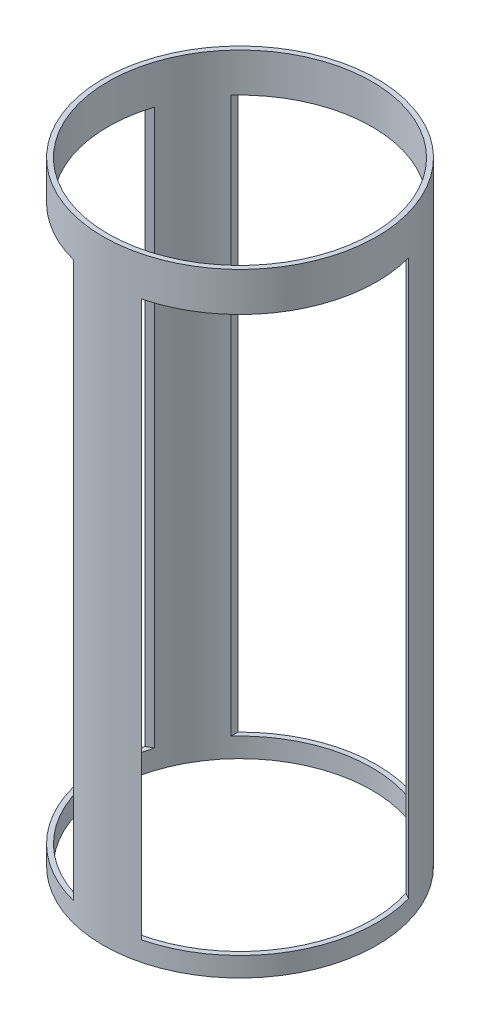
ISO-10303-21;
HEADER;
FILE_DESCRIPTION(('STEP AP214'),'2;1');
FILE_NAME('part.step','',(''),(''),'','','');
FILE_SCHEMA(('AUTOMOTIVE_DESIGN { 1 0 10303 214 1 1 1 1 }'));
ENDSEC;
DATA;
#1=APPLICATION_CONTEXT('core data for automotive mechanical design processes');
#2=APPLICATION_PROTOCOL_DEFINITION('international standard','automotive_design',2000,#1);
#3=PRODUCT_CONTEXT('',#1,'mechanical');
#4=PRODUCT('Part','Part','',(#3));
#5=PRODUCT_RELATED_PRODUCT_CATEGORY('part','',(#4));
#6=PRODUCT_DEFINITION_FORMATION('','',#4);
#7=PRODUCT_DEFINITION_CONTEXT('part definition',#1,'design');
#8=PRODUCT_DEFINITION('design','',#6,#7);
#9=PRODUCT_DEFINITION_SHAPE('','',#8);
#10=(LENGTH_UNIT() NAMED_UNIT(*) SI_UNIT(.MILLI.,.METRE.));
#11=(NAMED_UNIT(*) PLANE_ANGLE_UNIT() SI_UNIT($,.RADIAN.));
#12=(NAMED_UNIT(*) SI_UNIT($,.STERADIAN.) SOLID_ANGLE_UNIT());
#13=UNCERTAINTY_MEASURE_WITH_UNIT(LENGTH_MEASURE(1.E-05),#10,'distance_accuracy_value','');
#14=(GEOMETRIC_REPRESENTATION_CONTEXT(3) GLOBAL_UNCERTAINTY_ASSIGNED_CONTEXT((#13)) GLOBAL_UNIT_ASSIGNED_CONTEXT((#10,
#11,#12)) REPRESENTATION_CONTEXT('',''));
#15=CARTESIAN_POINT('',(0.,0.,0.));
#16=DIRECTION('',(0.,0.,1.));
#17=DIRECTION('',(1.,0.,0.));
#18=AXIS2_PLACEMENT_3D('',#15,#16,#17);
#19=CARTESIAN_POINT('',(0.,199.39,0.));
#20=DIRECTION('',(0.,1.,0.));
#21=DIRECTION('',(0.,0.,1.));
#22=AXIS2_PLACEMENT_3D('',#19,#20,#21);
#23=PLANE('',#22);
#24=CARTESIAN_POINT('',(0.,199.39,0.));
#25=DIRECTION('',(0.,1.,0.));
#26=DIRECTION('',(0.,0.,1.));
#27=AXIS2_PLACEMENT_3D('',#24,#25,#26);
#28=CIRCLE('',#27,88.9);
#29=CARTESIAN_POINT('',(0.,199.39,88.9));
#30=VERTEX_POINT('',#29);
#31=EDGE_CURVE('E226',#30,#30,#28,.T.);
#32=ORIENTED_EDGE('',*,*,#31,.T.);
#33=EDGE_LOOP('',(#32));
#34=FACE_BOUND('',#33,.T.);
#35=CARTESIAN_POINT('',(0.,199.39,0.));
#36=DIRECTION('',(0.,1.,0.));
#37=DIRECTION('',(0.,0.,1.));
#38=AXIS2_PLACEMENT_3D('',#35,#36,#37);
#39=CIRCLE('',#38,85.725);
#40=CARTESIAN_POINT('',(0.,199.39,85.725));
#41=VERTEX_POINT('',#40);
#42=EDGE_CURVE('E220',#41,#41,#39,.T.);
#43=ORIENTED_EDGE('',*,*,#42,.F.);
#44=EDGE_LOOP('',(#43));
#45=FACE_BOUND('',#44,.T.);
#46=ADVANCED_FACE('F41',(#34,#45),#23,.T.);
#47=CARTESIAN_POINT('',(0.,-199.39,0.));
#48=DIRECTION('',(0.,1.,0.));
#49=DIRECTION('',(0.,0.,1.));
#50=AXIS2_PLACEMENT_3D('',#47,#48,#49);
#51=PLANE('',#50);
#52=CARTESIAN_POINT('',(0.,-199.39,0.));
#53=DIRECTION('',(0.,1.,0.));
#54=DIRECTION('',(0.,0.,1.));
#55=AXIS2_PLACEMENT_3D('',#52,#53,#54);
#56=CIRCLE('',#55,88.9);
#57=CARTESIAN_POINT('',(0.,-199.39,88.9));
#58=VERTEX_POINT('',#57);
#59=EDGE_CURVE('E223',#58,#58,#56,.T.);
#60=ORIENTED_EDGE('',*,*,#59,.F.);
#61=EDGE_LOOP('',(#60));
#62=FACE_BOUND('',#61,.T.);
#63=CARTESIAN_POINT('',(0.,-199.39,0.));
#64=DIRECTION('',(0.,1.,0.));
#65=DIRECTION('',(0.,0.,1.));
#66=AXIS2_PLACEMENT_3D('',#63,#64,#65);
#67=CIRCLE('',#66,85.725);
#68=CARTESIAN_POINT('',(0.,-199.39,85.725));
#69=VERTEX_POINT('',#68);
#70=EDGE_CURVE('E200',#69,#69,#67,.T.);
#71=ORIENTED_EDGE('',*,*,#70,.T.);
#72=EDGE_LOOP('',(#71));
#73=FACE_BOUND('',#72,.T.);
#74=ADVANCED_FACE('F256',(#62,#73),#51,.F.);
#75=CARTESIAN_POINT('',(0.,199.39,0.));
#76=DIRECTION('',(0.,-1.,0.));
#77=DIRECTION('',(0.,0.,-1.));
#78=AXIS2_PLACEMENT_3D('',#75,#76,#77);
#79=CYLINDRICAL_SURFACE('',#78,88.9);
#80=CARTESIAN_POINT('',(0.,-186.69,0.));
#81=DIRECTION('',(0.,-1.,0.));
#82=DIRECTION('',(0.866025403784436,0.,0.500000000000004));
#83=AXIS2_PLACEMENT_3D('',#80,#81,#82);
#84=CIRCLE('',#83,88.9);
#85=CARTESIAN_POINT('',(22.1315367264145,-186.69,86.1011328736583));
#86=VERTEX_POINT('',#85);
#87=CARTESIAN_POINT('',(85.631536726415,-186.69,-23.8840934069651));
#88=VERTEX_POINT('',#87);
#89=EDGE_CURVE('E162',#86,#88,#84,.F.);
#90=ORIENTED_EDGE('',*,*,#89,.F.);
#91=DIRECTION('',(0.,-1.,0.));
#92=VECTOR('',#91,1.);
#93=CARTESIAN_POINT('',(22.1315367264145,199.39,86.1011328736583));
#94=LINE('',#93,#92);
#95=CARTESIAN_POINT('',(22.1315367264145,173.99,86.1011328736583));
#96=VERTEX_POINT('',#95);
#97=EDGE_CURVE('E167',#96,#86,#94,.T.);
#98=ORIENTED_EDGE('',*,*,#97,.F.);
#99=CARTESIAN_POINT('',(0.,173.99,0.));
#100=DIRECTION('',(0.,1.,0.));
#101=DIRECTION('',(0.500000000000004,0.,-0.866025403784436));
#102=AXIS2_PLACEMENT_3D('',#99,#100,#101);
#103=CIRCLE('',#102,88.9);
#104=CARTESIAN_POINT('',(85.631536726415,173.99,-23.8840934069651));
#105=VERTEX_POINT('',#104);
#106=EDGE_CURVE('E141',#105,#96,#103,.F.);
#107=ORIENTED_EDGE('',*,*,#106,.F.);
#108=DIRECTION('',(0.,-1.,0.));
#109=VECTOR('',#108,1.);
#110=CARTESIAN_POINT('',(85.631536726415,199.39,-23.8840934069651));
#111=LINE('',#110,#109);
#112=EDGE_CURVE('E56',#88,#105,#111,.F.);
#113=ORIENTED_EDGE('',*,*,#112,.F.);
#114=EDGE_LOOP('',(#90,#98,#107,#113));
#115=FACE_BOUND('',#114,.T.);
#116=CARTESIAN_POINT('',(0.,-186.69,0.));
#117=DIRECTION('',(0.,-1.,0.));
#118=DIRECTION('',(-0.866025403784443,0.,0.499999999999992));
#119=AXIS2_PLACEMENT_3D('',#116,#117,#118);
#120=CIRCLE('',#119,88.9);
#121=CARTESIAN_POINT('',(-85.6315367264147,-186.69,-23.8840934069663));
#122=VERTEX_POINT('',#121);
#123=CARTESIAN_POINT('',(-22.1315367264158,-186.69,86.101132873658));
#124=VERTEX_POINT('',#123);
#125=EDGE_CURVE('E191',#122,#124,#120,.F.);
#126=ORIENTED_EDGE('',*,*,#125,.F.);
#127=DIRECTION('',(0.,-1.,0.));
#128=VECTOR('',#127,1.);
#129=CARTESIAN_POINT('',(-85.6315367264147,199.39,-23.8840934069663));
#130=LINE('',#129,#128);
#131=CARTESIAN_POINT('',(-85.6315367264147,173.99,-23.8840934069663));
#132=VERTEX_POINT('',#131);
#133=EDGE_CURVE('E142',#132,#122,#130,.T.);
#134=ORIENTED_EDGE('',*,*,#133,.F.);
#135=CARTESIAN_POINT('',(0.,173.99,0.));
#136=DIRECTION('',(0.,1.,0.));
#137=DIRECTION('',(0.499999999999992,0.,0.866025403784443));
#138=AXIS2_PLACEMENT_3D('',#135,#136,#137);
#139=CIRCLE('',#138,88.9);
#140=CARTESIAN_POINT('',(-22.1315367264158,173.99,86.101132873658));
#141=VERTEX_POINT('',#140);
#142=EDGE_CURVE('E173',#141,#132,#139,.F.);
#143=ORIENTED_EDGE('',*,*,#142,.F.);
#144=DIRECTION('',(0.,-1.,0.));
#145=VECTOR('',#144,1.);
#146=CARTESIAN_POINT('',(-22.1315367264158,199.39,86.101132873658));
#147=LINE('',#146,#145);
#148=EDGE_CURVE('E64',#124,#141,#147,.F.);
#149=ORIENTED_EDGE('',*,*,#148,.F.);
#150=EDGE_LOOP('',(#126,#134,#143,#149));
#151=FACE_BOUND('',#150,.T.);
#152=CARTESIAN_POINT('',(0.,-186.69,0.));
#153=DIRECTION('',(0.,-1.,0.));
#154=DIRECTION('',(0.,0.,-1.));
#155=AXIS2_PLACEMENT_3D('',#152,#153,#154);
#156=CIRCLE('',#155,88.9);
#157=CARTESIAN_POINT('',(63.5,-186.69,-62.2170394666927));
#158=VERTEX_POINT('',#157);
#159=CARTESIAN_POINT('',(-63.5,-186.69,-62.2170394666927));
#160=VERTEX_POINT('',#159);
#161=EDGE_CURVE('E201',#158,#160,#156,.F.);
#162=ORIENTED_EDGE('',*,*,#161,.F.);
#163=DIRECTION('',(0.,-1.,0.));
#164=VECTOR('',#163,1.);
#165=CARTESIAN_POINT('',(63.5,199.39,-62.2170394666927));
#166=LINE('',#165,#164);
#167=CARTESIAN_POINT('',(63.5,173.99,-62.2170394666927));
#168=VERTEX_POINT('',#167);
#169=EDGE_CURVE('E204',#168,#158,#166,.T.);
#170=ORIENTED_EDGE('',*,*,#169,.F.);
#171=CARTESIAN_POINT('',(0.,173.99,0.));
#172=DIRECTION('',(0.,1.,0.));
#173=DIRECTION('',(-1.,0.,0.));
#174=AXIS2_PLACEMENT_3D('',#171,#172,#173);
#175=CIRCLE('',#174,88.9);
#176=CARTESIAN_POINT('',(-63.5,173.99,-62.2170394666927));
#177=VERTEX_POINT('',#176);
#178=EDGE_CURVE('E207',#177,#168,#175,.F.);
#179=ORIENTED_EDGE('',*,*,#178,.F.);
#180=DIRECTION('',(0.,-1.,0.));
#181=VECTOR('',#180,1.);
#182=CARTESIAN_POINT('',(-63.5,199.39,-62.2170394666927));
#183=LINE('',#182,#181);
#184=EDGE_CURVE('E198',#160,#177,#183,.F.);
#185=ORIENTED_EDGE('',*,*,#184,.F.);
#186=EDGE_LOOP('',(#162,#170,#179,#185));
#187=FACE_BOUND('',#186,.T.);
#188=ORIENTED_EDGE('',*,*,#31,.F.);
#189=EDGE_LOOP('',(#188));
#190=FACE_BOUND('',#189,.T.);
#191=ORIENTED_EDGE('',*,*,#59,.T.);
#192=EDGE_LOOP('',(#191));
#193=FACE_BOUND('',#192,.T.);
#194=ADVANCED_FACE('F43',(#115,#151,#187,#190,#193),#79,.T.);
#195=CARTESIAN_POINT('',(0.,199.39,0.));
#196=DIRECTION('',(0.,-1.,0.));
#197=DIRECTION('',(0.,0.,-1.));
#198=AXIS2_PLACEMENT_3D('',#195,#196,#197);
#199=CYLINDRICAL_SURFACE('',#198,85.725);
#200=DIRECTION('',(0.,-1.,0.));
#201=VECTOR('',#200,1.);
#202=CARTESIAN_POINT('',(18.1237828798855,199.39,83.787255111519));
#203=LINE('',#202,#201);
#204=CARTESIAN_POINT('',(18.1237828798855,-186.69,83.787255111519));
#205=VERTEX_POINT('',#204);
#206=CARTESIAN_POINT('',(18.1237828798855,173.99,83.787255111519));
#207=VERTEX_POINT('',#206);
#208=EDGE_CURVE('E165',#205,#207,#203,.F.);
#209=ORIENTED_EDGE('',*,*,#208,.F.);
#210=CARTESIAN_POINT('',(0.,-186.69,0.));
#211=DIRECTION('',(0.,-1.,0.));
#212=DIRECTION('',(0.866025403784436,0.,0.500000000000004));
#213=AXIS2_PLACEMENT_3D('',#210,#211,#212);
#214=CIRCLE('',#213,85.725);
#215=CARTESIAN_POINT('',(81.6237828798861,-186.69,-26.1979711691044));
#216=VERTEX_POINT('',#215);
#217=EDGE_CURVE('E151',#216,#205,#214,.T.);
#218=ORIENTED_EDGE('',*,*,#217,.F.);
#219=DIRECTION('',(0.,-1.,0.));
#220=VECTOR('',#219,1.);
#221=CARTESIAN_POINT('',(81.6237828798861,199.39,-26.1979711691044));
#222=LINE('',#221,#220);
#223=CARTESIAN_POINT('',(81.6237828798861,173.99,-26.1979711691044));
#224=VERTEX_POINT('',#223);
#225=EDGE_CURVE('E145',#224,#216,#222,.T.);
#226=ORIENTED_EDGE('',*,*,#225,.F.);
#227=CARTESIAN_POINT('',(0.,173.99,0.));
#228=DIRECTION('',(0.,1.,0.));
#229=DIRECTION('',(0.500000000000004,0.,-0.866025403784436));
#230=AXIS2_PLACEMENT_3D('',#227,#228,#229);
#231=CIRCLE('',#230,85.725);
#232=EDGE_CURVE('E132',#207,#224,#231,.T.);
#233=ORIENTED_EDGE('',*,*,#232,.F.);
#234=EDGE_LOOP('',(#209,#218,#226,#233));
#235=FACE_BOUND('',#234,.T.);
#236=DIRECTION('',(0.,-1.,0.));
#237=VECTOR('',#236,1.);
#238=CARTESIAN_POINT('',(-81.6237828798856,199.39,-26.1979711691055));
#239=LINE('',#238,#237);
#240=CARTESIAN_POINT('',(-81.6237828798856,-186.69,-26.1979711691055));
#241=VERTEX_POINT('',#240);
#242=CARTESIAN_POINT('',(-81.6237828798857,173.99,-26.1979711691055));
#243=VERTEX_POINT('',#242);
#244=EDGE_CURVE('E194',#241,#243,#239,.F.);
#245=ORIENTED_EDGE('',*,*,#244,.F.);
#246=CARTESIAN_POINT('',(0.,-186.69,0.));
#247=DIRECTION('',(0.,-1.,0.));
#248=DIRECTION('',(-0.866025403784443,0.,0.499999999999992));
#249=AXIS2_PLACEMENT_3D('',#246,#247,#248);
#250=CIRCLE('',#249,85.725);
#251=CARTESIAN_POINT('',(-18.1237828798867,-186.69,83.7872551115187));
#252=VERTEX_POINT('',#251);
#253=EDGE_CURVE('E186',#252,#241,#250,.T.);
#254=ORIENTED_EDGE('',*,*,#253,.F.);
#255=DIRECTION('',(0.,-1.,0.));
#256=VECTOR('',#255,1.);
#257=CARTESIAN_POINT('',(-18.1237828798867,199.39,83.7872551115187));
#258=LINE('',#257,#256);
#259=CARTESIAN_POINT('',(-18.1237828798867,173.99,83.7872551115187));
#260=VERTEX_POINT('',#259);
#261=EDGE_CURVE('E180',#260,#252,#258,.T.);
#262=ORIENTED_EDGE('',*,*,#261,.F.);
#263=CARTESIAN_POINT('',(0.,173.99,0.));
#264=DIRECTION('',(0.,1.,0.));
#265=DIRECTION('',(0.499999999999992,0.,0.866025403784443));
#266=AXIS2_PLACEMENT_3D('',#263,#264,#265);
#267=CIRCLE('',#266,85.725);
#268=EDGE_CURVE('E171',#243,#260,#267,.T.);
#269=ORIENTED_EDGE('',*,*,#268,.F.);
#270=EDGE_LOOP('',(#245,#254,#262,#269));
#271=FACE_BOUND('',#270,.T.);
#272=DIRECTION('',(0.,-1.,0.));
#273=VECTOR('',#272,1.);
#274=CARTESIAN_POINT('',(63.5,199.39,-57.5892839424141));
#275=LINE('',#274,#273);
#276=CARTESIAN_POINT('',(63.5,-186.69,-57.5892839424141));
#277=VERTEX_POINT('',#276);
#278=CARTESIAN_POINT('',(63.5,173.99,-57.5892839424141));
#279=VERTEX_POINT('',#278);
#280=EDGE_CURVE('E11',#277,#279,#275,.F.);
#281=ORIENTED_EDGE('',*,*,#280,.F.);
#282=CARTESIAN_POINT('',(0.,-186.69,0.));
#283=DIRECTION('',(0.,-1.,0.));
#284=DIRECTION('',(0.,0.,-1.));
#285=AXIS2_PLACEMENT_3D('',#282,#283,#284);
#286=CIRCLE('',#285,85.725);
#287=CARTESIAN_POINT('',(-63.5,-186.69,-57.5892839424142));
#288=VERTEX_POINT('',#287);
#289=EDGE_CURVE('E49',#288,#277,#286,.T.);
#290=ORIENTED_EDGE('',*,*,#289,.F.);
#291=DIRECTION('',(0.,-1.,0.));
#292=VECTOR('',#291,1.);
#293=CARTESIAN_POINT('',(-63.5,199.39,-57.5892839424142));
#294=LINE('',#293,#292);
#295=CARTESIAN_POINT('',(-63.5,173.99,-57.5892839424142));
#296=VERTEX_POINT('',#295);
#297=EDGE_CURVE('E233',#296,#288,#294,.T.);
#298=ORIENTED_EDGE('',*,*,#297,.F.);
#299=CARTESIAN_POINT('',(0.,173.99,0.));
#300=DIRECTION('',(0.,1.,0.));
#301=DIRECTION('',(-1.,0.,0.));
#302=AXIS2_PLACEMENT_3D('',#299,#300,#301);
#303=CIRCLE('',#302,85.725);
#304=EDGE_CURVE('E229',#279,#296,#303,.T.);
#305=ORIENTED_EDGE('',*,*,#304,.F.);
#306=EDGE_LOOP('',(#281,#290,#298,#305));
#307=FACE_BOUND('',#306,.T.);
#308=ORIENTED_EDGE('',*,*,#42,.T.);
#309=EDGE_LOOP('',(#308));
#310=FACE_BOUND('',#309,.T.);
#311=ORIENTED_EDGE('',*,*,#70,.F.);
#312=EDGE_LOOP('',(#311));
#313=FACE_BOUND('',#312,.T.);
#314=ADVANCED_FACE('F149',(#235,#271,#307,#310,#313),#199,.F.);
#315=CARTESIAN_POINT('',(63.5,-186.69,-88.901));
#316=DIRECTION('',(1.,0.,0.));
#317=DIRECTION('',(0.,0.,-1.));
#318=AXIS2_PLACEMENT_3D('',#315,#316,#317);
#319=PLANE('',#318);
#320=ORIENTED_EDGE('',*,*,#280,.T.);
#321=DIRECTION('',(0.,0.,1.));
#322=VECTOR('',#321,1.);
#323=CARTESIAN_POINT('',(63.5,173.99,-88.901));
#324=LINE('',#323,#322);
#325=EDGE_CURVE('E170',#168,#279,#324,.T.);
#326=ORIENTED_EDGE('',*,*,#325,.F.);
#327=ORIENTED_EDGE('',*,*,#169,.T.);
#328=DIRECTION('',(0.,0.,1.));
#329=VECTOR('',#328,1.);
#330=CARTESIAN_POINT('',(63.5,-186.69,-88.901));
#331=LINE('',#330,#329);
#332=EDGE_CURVE('E211',#158,#277,#331,.T.);
#333=ORIENTED_EDGE('',*,*,#332,.T.);
#334=EDGE_LOOP('',(#320,#326,#327,#333));
#335=FACE_BOUND('',#334,.T.);
#336=ADVANCED_FACE('F241',(#335),#319,.F.);
#337=CARTESIAN_POINT('',(-63.5,-186.69,-88.901));
#338=DIRECTION('',(0.,-1.,0.));
#339=DIRECTION('',(0.,0.,-1.));
#340=AXIS2_PLACEMENT_3D('',#337,#338,#339);
#341=PLANE('',#340);
#342=ORIENTED_EDGE('',*,*,#289,.T.);
#343=ORIENTED_EDGE('',*,*,#332,.F.);
#344=ORIENTED_EDGE('',*,*,#161,.T.);
#345=DIRECTION('',(0.,0.,1.));
#346=VECTOR('',#345,1.);
#347=CARTESIAN_POINT('',(-63.5,-186.69,-88.901));
#348=LINE('',#347,#346);
#349=EDGE_CURVE('E214',#160,#288,#348,.T.);
#350=ORIENTED_EDGE('',*,*,#349,.T.);
#351=EDGE_LOOP('',(#342,#343,#344,#350));
#352=FACE_BOUND('',#351,.T.);
#353=ADVANCED_FACE('F236',(#352),#341,.F.);
#354=CARTESIAN_POINT('',(-63.5,-186.69,-88.901));
#355=DIRECTION('',(-1.,0.,0.));
#356=DIRECTION('',(0.,0.,1.));
#357=AXIS2_PLACEMENT_3D('',#354,#355,#356);
#358=PLANE('',#357);
#359=ORIENTED_EDGE('',*,*,#297,.T.);
#360=ORIENTED_EDGE('',*,*,#349,.F.);
#361=ORIENTED_EDGE('',*,*,#184,.T.);
#362=DIRECTION('',(0.,0.,1.));
#363=VECTOR('',#362,1.);
#364=CARTESIAN_POINT('',(-63.5,173.99,-88.901));
#365=LINE('',#364,#363);
#366=EDGE_CURVE('E210',#177,#296,#365,.T.);
#367=ORIENTED_EDGE('',*,*,#366,.T.);
#368=EDGE_LOOP('',(#359,#360,#361,#367));
#369=FACE_BOUND('',#368,.T.);
#370=ADVANCED_FACE('F251',(#369),#358,.F.);
#371=CARTESIAN_POINT('',(-63.5,173.99,-88.901));
#372=DIRECTION('',(0.,1.,0.));
#373=DIRECTION('',(-1.,0.,0.));
#374=AXIS2_PLACEMENT_3D('',#371,#372,#373);
#375=PLANE('',#374);
#376=ORIENTED_EDGE('',*,*,#304,.T.);
#377=ORIENTED_EDGE('',*,*,#366,.F.);
#378=ORIENTED_EDGE('',*,*,#178,.T.);
#379=ORIENTED_EDGE('',*,*,#325,.T.);
#380=EDGE_LOOP('',(#376,#377,#378,#379));
#381=FACE_BOUND('',#380,.T.);
#382=ADVANCED_FACE('F248',(#381),#375,.F.);
#383=CARTESIAN_POINT('',(-108.74052442184,-186.69,-10.5421131403129));
#384=DIRECTION('',(-0.499999999999992,0.,-0.866025403784443));
#385=DIRECTION('',(-0.866025403784443,0.,0.499999999999992));
#386=AXIS2_PLACEMENT_3D('',#383,#384,#385);
#387=PLANE('',#386);
#388=ORIENTED_EDGE('',*,*,#244,.T.);
#389=DIRECTION('',(0.866025403784443,0.,-0.499999999999992));
#390=VECTOR('',#389,1.);
#391=CARTESIAN_POINT('',(-108.74052442184,173.99,-10.5421131403129));
#392=LINE('',#391,#390);
#393=EDGE_CURVE('E177',#132,#243,#392,.T.);
#394=ORIENTED_EDGE('',*,*,#393,.F.);
#395=ORIENTED_EDGE('',*,*,#133,.T.);
#396=DIRECTION('',(0.866025403784443,0.,-0.499999999999992));
#397=VECTOR('',#396,1.);
#398=CARTESIAN_POINT('',(-108.74052442184,-186.69,-10.5421131403129));
#399=LINE('',#398,#397);
#400=EDGE_CURVE('E188',#122,#241,#399,.T.);
#401=ORIENTED_EDGE('',*,*,#400,.T.);
#402=EDGE_LOOP('',(#388,#394,#395,#401));
#403=FACE_BOUND('',#402,.T.);
#404=ADVANCED_FACE('F303',(#403),#387,.F.);
#405=CARTESIAN_POINT('',(-45.2405244218413,-186.69,99.4431131403114));
#406=DIRECTION('',(0.,-1.,0.));
#407=DIRECTION('',(-0.866025403784443,0.,0.499999999999992));
#408=AXIS2_PLACEMENT_3D('',#405,#406,#407);
#409=PLANE('',#408);
#410=ORIENTED_EDGE('',*,*,#253,.T.);
#411=ORIENTED_EDGE('',*,*,#400,.F.);
#412=ORIENTED_EDGE('',*,*,#125,.T.);
#413=DIRECTION('',(0.866025403784443,0.,-0.499999999999992));
#414=VECTOR('',#413,1.);
#415=CARTESIAN_POINT('',(-45.2405244218413,-186.69,99.4431131403114));
#416=LINE('',#415,#414);
#417=EDGE_CURVE('E182',#124,#252,#416,.T.);
#418=ORIENTED_EDGE('',*,*,#417,.T.);
#419=EDGE_LOOP('',(#410,#411,#412,#418));
#420=FACE_BOUND('',#419,.T.);
#421=ADVANCED_FACE('F308',(#420),#409,.F.);
#422=CARTESIAN_POINT('',(-45.2405244218413,-186.69,99.4431131403114));
#423=DIRECTION('',(0.499999999999992,0.,0.866025403784443));
#424=DIRECTION('',(0.866025403784443,0.,-0.499999999999992));
#425=AXIS2_PLACEMENT_3D('',#422,#423,#424);
#426=PLANE('',#425);
#427=ORIENTED_EDGE('',*,*,#261,.T.);
#428=ORIENTED_EDGE('',*,*,#417,.F.);
#429=ORIENTED_EDGE('',*,*,#148,.T.);
#430=DIRECTION('',(0.866025403784443,0.,-0.499999999999992));
#431=VECTOR('',#430,1.);
#432=CARTESIAN_POINT('',(-45.2405244218413,173.99,99.4431131403114));
#433=LINE('',#432,#431);
#434=EDGE_CURVE('E175',#141,#260,#433,.T.);
#435=ORIENTED_EDGE('',*,*,#434,.T.);
#436=EDGE_LOOP('',(#427,#428,#429,#435));
#437=FACE_BOUND('',#436,.T.);
#438=ADVANCED_FACE('F318',(#437),#426,.F.);
#439=CARTESIAN_POINT('',(-45.2405244218413,173.99,99.4431131403114));
#440=DIRECTION('',(0.,1.,0.));
#441=DIRECTION('',(0.499999999999992,0.,0.866025403784443));
#442=AXIS2_PLACEMENT_3D('',#439,#440,#441);
#443=PLANE('',#442);
#444=ORIENTED_EDGE('',*,*,#268,.T.);
#445=ORIENTED_EDGE('',*,*,#434,.F.);
#446=ORIENTED_EDGE('',*,*,#142,.T.);
#447=ORIENTED_EDGE('',*,*,#393,.T.);
#448=EDGE_LOOP('',(#444,#445,#446,#447));
#449=FACE_BOUND('',#448,.T.);
#450=ADVANCED_FACE('F328',(#449),#443,.F.);
#451=CARTESIAN_POINT('',(45.2405244218399,-186.69,99.4431131403121));
#452=DIRECTION('',(-0.500000000000004,0.,0.866025403784436));
#453=DIRECTION('',(0.866025403784436,0.,0.500000000000004));
#454=AXIS2_PLACEMENT_3D('',#451,#452,#453);
#455=PLANE('',#454);
#456=ORIENTED_EDGE('',*,*,#208,.T.);
#457=DIRECTION('',(-0.866025403784436,0.,-0.500000000000004));
#458=VECTOR('',#457,1.);
#459=CARTESIAN_POINT('',(45.2405244218399,173.99,99.4431131403121));
#460=LINE('',#459,#458);
#461=EDGE_CURVE('E137',#96,#207,#460,.T.);
#462=ORIENTED_EDGE('',*,*,#461,.F.);
#463=ORIENTED_EDGE('',*,*,#97,.T.);
#464=DIRECTION('',(-0.866025403784436,0.,-0.500000000000004));
#465=VECTOR('',#464,1.);
#466=CARTESIAN_POINT('',(45.2405244218399,-186.69,99.4431131403121));
#467=LINE('',#466,#465);
#468=EDGE_CURVE('E159',#86,#205,#467,.T.);
#469=ORIENTED_EDGE('',*,*,#468,.T.);
#470=EDGE_LOOP('',(#456,#462,#463,#469));
#471=FACE_BOUND('',#470,.T.);
#472=ADVANCED_FACE('F337',(#471),#455,.F.);
#473=CARTESIAN_POINT('',(108.74052442184,-186.69,-10.5421131403113));
#474=DIRECTION('',(0.,-1.,0.));
#475=DIRECTION('',(0.866025403784436,0.,0.500000000000004));
#476=AXIS2_PLACEMENT_3D('',#473,#474,#475);
#477=PLANE('',#476);
#478=ORIENTED_EDGE('',*,*,#217,.T.);
#479=ORIENTED_EDGE('',*,*,#468,.F.);
#480=ORIENTED_EDGE('',*,*,#89,.T.);
#481=DIRECTION('',(-0.866025403784436,0.,-0.500000000000004));
#482=VECTOR('',#481,1.);
#483=CARTESIAN_POINT('',(108.74052442184,-186.69,-10.5421131403113));
#484=LINE('',#483,#482);
#485=EDGE_CURVE('E152',#88,#216,#484,.T.);
#486=ORIENTED_EDGE('',*,*,#485,.T.);
#487=EDGE_LOOP('',(#478,#479,#480,#486));
#488=FACE_BOUND('',#487,.T.);
#489=ADVANCED_FACE('F347',(#488),#477,.F.);
#490=CARTESIAN_POINT('',(108.74052442184,-186.69,-10.5421131403113));
#491=DIRECTION('',(0.500000000000004,0.,-0.866025403784436));
#492=DIRECTION('',(-0.866025403784436,0.,-0.500000000000004));
#493=AXIS2_PLACEMENT_3D('',#490,#491,#492);
#494=PLANE('',#493);
#495=ORIENTED_EDGE('',*,*,#225,.T.);
#496=ORIENTED_EDGE('',*,*,#485,.F.);
#497=ORIENTED_EDGE('',*,*,#112,.T.);
#498=DIRECTION('',(-0.866025403784436,0.,-0.500000000000004));
#499=VECTOR('',#498,1.);
#500=CARTESIAN_POINT('',(108.74052442184,173.99,-10.5421131403113));
#501=LINE('',#500,#499);
#502=EDGE_CURVE('E134',#105,#224,#501,.T.);
#503=ORIENTED_EDGE('',*,*,#502,.T.);
#504=EDGE_LOOP('',(#495,#496,#497,#503));
#505=FACE_BOUND('',#504,.T.);
#506=ADVANCED_FACE('F144',(#505),#494,.F.);
#507=CARTESIAN_POINT('',(108.74052442184,173.99,-10.5421131403113));
#508=DIRECTION('',(0.,1.,0.));
#509=DIRECTION('',(0.500000000000004,0.,-0.866025403784436));
#510=AXIS2_PLACEMENT_3D('',#507,#508,#509);
#511=PLANE('',#510);
#512=ORIENTED_EDGE('',*,*,#232,.T.);
#513=ORIENTED_EDGE('',*,*,#502,.F.);
#514=ORIENTED_EDGE('',*,*,#106,.T.);
#515=ORIENTED_EDGE('',*,*,#461,.T.);
#516=EDGE_LOOP('',(#512,#513,#514,#515));
#517=FACE_BOUND('',#516,.T.);
#518=ADVANCED_FACE('F133',(#517),#511,.F.);
#519=CLOSED_SHELL('',(#46,#74,#194,#314,#336,#353,#370,#382,#404,#421,#438,#450,#472,#489,#506,#518));
#520=MANIFOLD_SOLID_BREP('B2',#519);
#521=ADVANCED_BREP_SHAPE_REPRESENTATION('',(#18,#520),#14);
#522=SHAPE_DEFINITION_REPRESENTATION(#9,#521);
ENDSEC;
END-ISO-10303-21;
